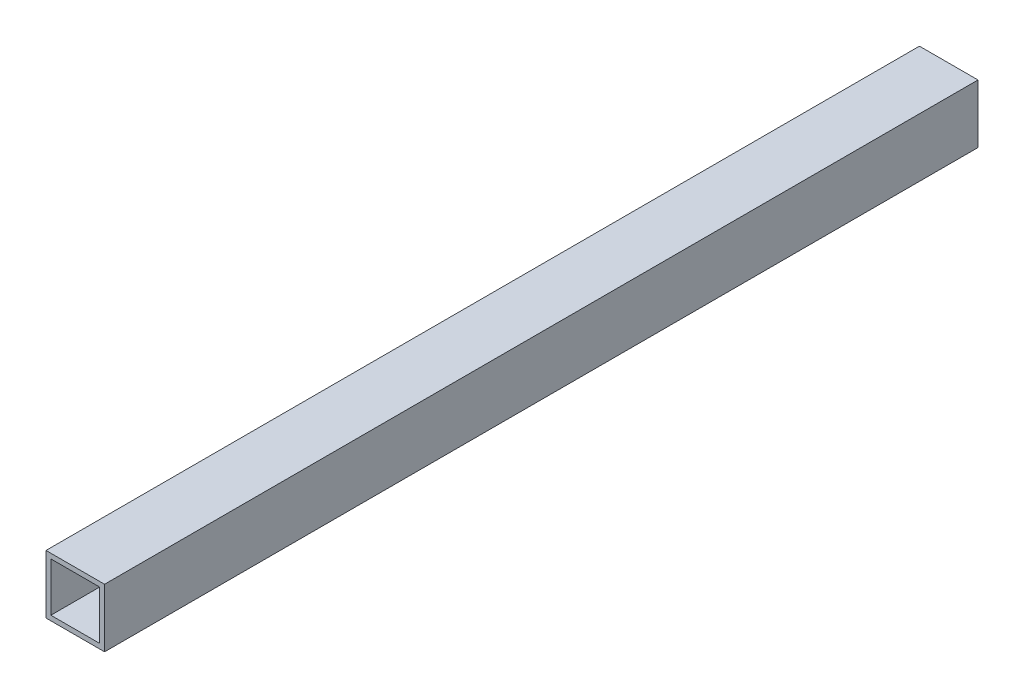
ISO-10303-21;
HEADER;
FILE_DESCRIPTION(('STEP AP214'),'2;1');
FILE_NAME('part.step','',(''),(''),'','','');
FILE_SCHEMA(('AUTOMOTIVE_DESIGN { 1 0 10303 214 1 1 1 1 }'));
ENDSEC;
DATA;
#1=APPLICATION_CONTEXT('core data for automotive mechanical design processes');
#2=APPLICATION_PROTOCOL_DEFINITION('international standard','automotive_design',2000,#1);
#3=PRODUCT_CONTEXT('',#1,'mechanical');
#4=PRODUCT('Part','Part','',(#3));
#5=PRODUCT_RELATED_PRODUCT_CATEGORY('part','',(#4));
#6=PRODUCT_DEFINITION_FORMATION('','',#4);
#7=PRODUCT_DEFINITION_CONTEXT('part definition',#1,'design');
#8=PRODUCT_DEFINITION('design','',#6,#7);
#9=PRODUCT_DEFINITION_SHAPE('','',#8);
#10=(LENGTH_UNIT() NAMED_UNIT(*) SI_UNIT(.MILLI.,.METRE.));
#11=(NAMED_UNIT(*) PLANE_ANGLE_UNIT() SI_UNIT($,.RADIAN.));
#12=(NAMED_UNIT(*) SI_UNIT($,.STERADIAN.) SOLID_ANGLE_UNIT());
#13=UNCERTAINTY_MEASURE_WITH_UNIT(LENGTH_MEASURE(1.E-05),#10,'distance_accuracy_value','');
#14=(GEOMETRIC_REPRESENTATION_CONTEXT(3) GLOBAL_UNCERTAINTY_ASSIGNED_CONTEXT((#13)) GLOBAL_UNIT_ASSIGNED_CONTEXT((#10,
#11,#12)) REPRESENTATION_CONTEXT('',''));
#15=CARTESIAN_POINT('',(0.,0.,0.));
#16=DIRECTION('',(0.,0.,1.));
#17=DIRECTION('',(1.,0.,0.));
#18=AXIS2_PLACEMENT_3D('',#15,#16,#17);
#19=CARTESIAN_POINT('',(0.,0.,358.));
#20=DIRECTION('',(0.,0.,1.));
#21=DIRECTION('',(1.,0.,0.));
#22=AXIS2_PLACEMENT_3D('',#19,#20,#21);
#23=PLANE('',#22);
#24=DIRECTION('',(0.,-1.,0.));
#25=VECTOR('',#24,1.);
#26=CARTESIAN_POINT('',(-12.,12.,358.));
#27=LINE('',#26,#25);
#28=CARTESIAN_POINT('',(-12.,12.,358.));
#29=VERTEX_POINT('',#28);
#30=CARTESIAN_POINT('',(-12.,-12.,358.));
#31=VERTEX_POINT('',#30);
#32=EDGE_CURVE('E136',#29,#31,#27,.T.);
#33=ORIENTED_EDGE('',*,*,#32,.T.);
#34=DIRECTION('',(1.,0.,0.));
#35=VECTOR('',#34,1.);
#36=CARTESIAN_POINT('',(-12.,-12.,358.));
#37=LINE('',#36,#35);
#38=CARTESIAN_POINT('',(12.,-12.,358.));
#39=VERTEX_POINT('',#38);
#40=EDGE_CURVE('E139',#31,#39,#37,.T.);
#41=ORIENTED_EDGE('',*,*,#40,.T.);
#42=DIRECTION('',(0.,1.,0.));
#43=VECTOR('',#42,1.);
#44=CARTESIAN_POINT('',(12.,12.,358.));
#45=LINE('',#44,#43);
#46=CARTESIAN_POINT('',(12.,12.,358.));
#47=VERTEX_POINT('',#46);
#48=EDGE_CURVE('E142',#39,#47,#45,.T.);
#49=ORIENTED_EDGE('',*,*,#48,.T.);
#50=DIRECTION('',(-1.,0.,0.));
#51=VECTOR('',#50,1.);
#52=CARTESIAN_POINT('',(-12.,12.,358.));
#53=LINE('',#52,#51);
#54=EDGE_CURVE('E144',#47,#29,#53,.T.);
#55=ORIENTED_EDGE('',*,*,#54,.T.);
#56=EDGE_LOOP('',(#33,#41,#49,#55));
#57=FACE_BOUND('',#56,.T.);
#58=DIRECTION('',(-1.,0.,0.));
#59=VECTOR('',#58,1.);
#60=CARTESIAN_POINT('',(-10.,10.,358.));
#61=LINE('',#60,#59);
#62=CARTESIAN_POINT('',(10.,10.,358.));
#63=VERTEX_POINT('',#62);
#64=CARTESIAN_POINT('',(-10.,10.,358.));
#65=VERTEX_POINT('',#64);
#66=EDGE_CURVE('E108',#63,#65,#61,.T.);
#67=ORIENTED_EDGE('',*,*,#66,.F.);
#68=DIRECTION('',(0.,1.,0.));
#69=VECTOR('',#68,1.);
#70=CARTESIAN_POINT('',(10.,10.,358.));
#71=LINE('',#70,#69);
#72=CARTESIAN_POINT('',(10.,-10.,358.));
#73=VERTEX_POINT('',#72);
#74=EDGE_CURVE('E100',#73,#63,#71,.T.);
#75=ORIENTED_EDGE('',*,*,#74,.F.);
#76=DIRECTION('',(1.,0.,0.));
#77=VECTOR('',#76,1.);
#78=CARTESIAN_POINT('',(-10.,-10.,358.));
#79=LINE('',#78,#77);
#80=CARTESIAN_POINT('',(-10.,-10.,358.));
#81=VERTEX_POINT('',#80);
#82=EDGE_CURVE('E122',#81,#73,#79,.T.);
#83=ORIENTED_EDGE('',*,*,#82,.F.);
#84=DIRECTION('',(0.,-1.,0.));
#85=VECTOR('',#84,1.);
#86=CARTESIAN_POINT('',(-10.,10.,358.));
#87=LINE('',#86,#85);
#88=EDGE_CURVE('E120',#65,#81,#87,.T.);
#89=ORIENTED_EDGE('',*,*,#88,.F.);
#90=EDGE_LOOP('',(#67,#75,#83,#89));
#91=FACE_BOUND('',#90,.T.);
#92=ADVANCED_FACE('F35',(#57,#91),#23,.T.);
#93=CARTESIAN_POINT('',(0.,0.,0.));
#94=DIRECTION('',(0.,0.,1.));
#95=DIRECTION('',(1.,0.,0.));
#96=AXIS2_PLACEMENT_3D('',#93,#94,#95);
#97=PLANE('',#96);
#98=DIRECTION('',(0.,-1.,0.));
#99=VECTOR('',#98,1.);
#100=CARTESIAN_POINT('',(-12.,12.,0.));
#101=LINE('',#100,#99);
#102=CARTESIAN_POINT('',(-12.,12.,0.));
#103=VERTEX_POINT('',#102);
#104=CARTESIAN_POINT('',(-12.,-12.,0.));
#105=VERTEX_POINT('',#104);
#106=EDGE_CURVE('E116',#103,#105,#101,.T.);
#107=ORIENTED_EDGE('',*,*,#106,.F.);
#108=DIRECTION('',(-1.,0.,0.));
#109=VECTOR('',#108,1.);
#110=CARTESIAN_POINT('',(-12.,12.,0.));
#111=LINE('',#110,#109);
#112=CARTESIAN_POINT('',(12.,12.,0.));
#113=VERTEX_POINT('',#112);
#114=EDGE_CURVE('E140',#113,#103,#111,.T.);
#115=ORIENTED_EDGE('',*,*,#114,.F.);
#116=DIRECTION('',(0.,1.,0.));
#117=VECTOR('',#116,1.);
#118=CARTESIAN_POINT('',(12.,12.,0.));
#119=LINE('',#118,#117);
#120=CARTESIAN_POINT('',(12.,-12.,0.));
#121=VERTEX_POINT('',#120);
#122=EDGE_CURVE('E151',#121,#113,#119,.T.);
#123=ORIENTED_EDGE('',*,*,#122,.F.);
#124=DIRECTION('',(1.,0.,0.));
#125=VECTOR('',#124,1.);
#126=CARTESIAN_POINT('',(-12.,-12.,0.));
#127=LINE('',#126,#125);
#128=EDGE_CURVE('E149',#105,#121,#127,.T.);
#129=ORIENTED_EDGE('',*,*,#128,.F.);
#130=EDGE_LOOP('',(#107,#115,#123,#129));
#131=FACE_BOUND('',#130,.T.);
#132=DIRECTION('',(0.,1.,0.));
#133=VECTOR('',#132,1.);
#134=CARTESIAN_POINT('',(10.,10.,0.));
#135=LINE('',#134,#133);
#136=CARTESIAN_POINT('',(10.,-10.,0.));
#137=VERTEX_POINT('',#136);
#138=CARTESIAN_POINT('',(10.,10.,0.));
#139=VERTEX_POINT('',#138);
#140=EDGE_CURVE('E58',#137,#139,#135,.T.);
#141=ORIENTED_EDGE('',*,*,#140,.T.);
#142=DIRECTION('',(-1.,0.,0.));
#143=VECTOR('',#142,1.);
#144=CARTESIAN_POINT('',(-10.,10.,0.));
#145=LINE('',#144,#143);
#146=CARTESIAN_POINT('',(-10.,10.,0.));
#147=VERTEX_POINT('',#146);
#148=EDGE_CURVE('E115',#139,#147,#145,.T.);
#149=ORIENTED_EDGE('',*,*,#148,.T.);
#150=DIRECTION('',(0.,-1.,0.));
#151=VECTOR('',#150,1.);
#152=CARTESIAN_POINT('',(-10.,10.,0.));
#153=LINE('',#152,#151);
#154=CARTESIAN_POINT('',(-10.,-10.,0.));
#155=VERTEX_POINT('',#154);
#156=EDGE_CURVE('E128',#147,#155,#153,.T.);
#157=ORIENTED_EDGE('',*,*,#156,.T.);
#158=DIRECTION('',(1.,0.,0.));
#159=VECTOR('',#158,1.);
#160=CARTESIAN_POINT('',(-10.,-10.,0.));
#161=LINE('',#160,#159);
#162=EDGE_CURVE('E109',#155,#137,#161,.T.);
#163=ORIENTED_EDGE('',*,*,#162,.T.);
#164=EDGE_LOOP('',(#141,#149,#157,#163));
#165=FACE_BOUND('',#164,.T.);
#166=ADVANCED_FACE('F169',(#131,#165),#97,.F.);
#167=CARTESIAN_POINT('',(-12.,12.,358.));
#168=DIRECTION('',(1.,0.,0.));
#169=DIRECTION('',(0.,1.,0.));
#170=AXIS2_PLACEMENT_3D('',#167,#168,#169);
#171=PLANE('',#170);
#172=ORIENTED_EDGE('',*,*,#106,.T.);
#173=DIRECTION('',(0.,0.,-1.));
#174=VECTOR('',#173,1.);
#175=CARTESIAN_POINT('',(-12.,-12.,358.));
#176=LINE('',#175,#174);
#177=EDGE_CURVE('E11',#31,#105,#176,.T.);
#178=ORIENTED_EDGE('',*,*,#177,.F.);
#179=ORIENTED_EDGE('',*,*,#32,.F.);
#180=DIRECTION('',(0.,0.,-1.));
#181=VECTOR('',#180,1.);
#182=CARTESIAN_POINT('',(-12.,12.,358.));
#183=LINE('',#182,#181);
#184=EDGE_CURVE('E146',#29,#103,#183,.T.);
#185=ORIENTED_EDGE('',*,*,#184,.T.);
#186=EDGE_LOOP('',(#172,#178,#179,#185));
#187=FACE_BOUND('',#186,.T.);
#188=ADVANCED_FACE('F37',(#187),#171,.F.);
#189=CARTESIAN_POINT('',(-12.,-12.,358.));
#190=DIRECTION('',(0.,1.,0.));
#191=DIRECTION('',(-1.,0.,0.));
#192=AXIS2_PLACEMENT_3D('',#189,#190,#191);
#193=PLANE('',#192);
#194=ORIENTED_EDGE('',*,*,#128,.T.);
#195=DIRECTION('',(0.,0.,-1.));
#196=VECTOR('',#195,1.);
#197=CARTESIAN_POINT('',(12.,-12.,358.));
#198=LINE('',#197,#196);
#199=EDGE_CURVE('E43',#39,#121,#198,.T.);
#200=ORIENTED_EDGE('',*,*,#199,.F.);
#201=ORIENTED_EDGE('',*,*,#40,.F.);
#202=ORIENTED_EDGE('',*,*,#177,.T.);
#203=EDGE_LOOP('',(#194,#200,#201,#202));
#204=FACE_BOUND('',#203,.T.);
#205=ADVANCED_FACE('F179',(#204),#193,.F.);
#206=CARTESIAN_POINT('',(12.,12.,358.));
#207=DIRECTION('',(-1.,0.,0.));
#208=DIRECTION('',(0.,-1.,0.));
#209=AXIS2_PLACEMENT_3D('',#206,#207,#208);
#210=PLANE('',#209);
#211=ORIENTED_EDGE('',*,*,#122,.T.);
#212=DIRECTION('',(0.,0.,-1.));
#213=VECTOR('',#212,1.);
#214=CARTESIAN_POINT('',(12.,12.,358.));
#215=LINE('',#214,#213);
#216=EDGE_CURVE('E156',#47,#113,#215,.T.);
#217=ORIENTED_EDGE('',*,*,#216,.F.);
#218=ORIENTED_EDGE('',*,*,#48,.F.);
#219=ORIENTED_EDGE('',*,*,#199,.T.);
#220=EDGE_LOOP('',(#211,#217,#218,#219));
#221=FACE_BOUND('',#220,.T.);
#222=ADVANCED_FACE('F163',(#221),#210,.F.);
#223=CARTESIAN_POINT('',(-12.,12.,358.));
#224=DIRECTION('',(0.,-1.,0.));
#225=DIRECTION('',(0.,0.,-1.));
#226=AXIS2_PLACEMENT_3D('',#223,#224,#225);
#227=PLANE('',#226);
#228=ORIENTED_EDGE('',*,*,#114,.T.);
#229=ORIENTED_EDGE('',*,*,#184,.F.);
#230=ORIENTED_EDGE('',*,*,#54,.F.);
#231=ORIENTED_EDGE('',*,*,#216,.T.);
#232=EDGE_LOOP('',(#228,#229,#230,#231));
#233=FACE_BOUND('',#232,.T.);
#234=ADVANCED_FACE('F173',(#233),#227,.F.);
#235=CARTESIAN_POINT('',(10.,10.,358.));
#236=DIRECTION('',(-1.,0.,0.));
#237=DIRECTION('',(0.,0.,1.));
#238=AXIS2_PLACEMENT_3D('',#235,#236,#237);
#239=PLANE('',#238);
#240=ORIENTED_EDGE('',*,*,#140,.F.);
#241=DIRECTION('',(0.,0.,-1.));
#242=VECTOR('',#241,1.);
#243=CARTESIAN_POINT('',(10.,-10.,358.));
#244=LINE('',#243,#242);
#245=EDGE_CURVE('E104',#73,#137,#244,.T.);
#246=ORIENTED_EDGE('',*,*,#245,.F.);
#247=ORIENTED_EDGE('',*,*,#74,.T.);
#248=DIRECTION('',(0.,0.,-1.));
#249=VECTOR('',#248,1.);
#250=CARTESIAN_POINT('',(10.,10.,358.));
#251=LINE('',#250,#249);
#252=EDGE_CURVE('E103',#63,#139,#251,.T.);
#253=ORIENTED_EDGE('',*,*,#252,.T.);
#254=EDGE_LOOP('',(#240,#246,#247,#253));
#255=FACE_BOUND('',#254,.T.);
#256=ADVANCED_FACE('F102',(#255),#239,.T.);
#257=CARTESIAN_POINT('',(-10.,10.,358.));
#258=DIRECTION('',(0.,-1.,0.));
#259=DIRECTION('',(0.,0.,-1.));
#260=AXIS2_PLACEMENT_3D('',#257,#258,#259);
#261=PLANE('',#260);
#262=ORIENTED_EDGE('',*,*,#148,.F.);
#263=ORIENTED_EDGE('',*,*,#252,.F.);
#264=ORIENTED_EDGE('',*,*,#66,.T.);
#265=DIRECTION('',(0.,0.,-1.));
#266=VECTOR('',#265,1.);
#267=CARTESIAN_POINT('',(-10.,10.,358.));
#268=LINE('',#267,#266);
#269=EDGE_CURVE('E117',#65,#147,#268,.T.);
#270=ORIENTED_EDGE('',*,*,#269,.T.);
#271=EDGE_LOOP('',(#262,#263,#264,#270));
#272=FACE_BOUND('',#271,.T.);
#273=ADVANCED_FACE('F112',(#272),#261,.T.);
#274=CARTESIAN_POINT('',(-10.,10.,358.));
#275=DIRECTION('',(1.,0.,0.));
#276=DIRECTION('',(0.,1.,0.));
#277=AXIS2_PLACEMENT_3D('',#274,#275,#276);
#278=PLANE('',#277);
#279=ORIENTED_EDGE('',*,*,#156,.F.);
#280=ORIENTED_EDGE('',*,*,#269,.F.);
#281=ORIENTED_EDGE('',*,*,#88,.T.);
#282=DIRECTION('',(0.,0.,-1.));
#283=VECTOR('',#282,1.);
#284=CARTESIAN_POINT('',(-10.,-10.,358.));
#285=LINE('',#284,#283);
#286=EDGE_CURVE('E50',#81,#155,#285,.T.);
#287=ORIENTED_EDGE('',*,*,#286,.T.);
#288=EDGE_LOOP('',(#279,#280,#281,#287));
#289=FACE_BOUND('',#288,.T.);
#290=ADVANCED_FACE('F202',(#289),#278,.T.);
#291=CARTESIAN_POINT('',(-10.,-10.,358.));
#292=DIRECTION('',(0.,1.,0.));
#293=DIRECTION('',(0.,0.,1.));
#294=AXIS2_PLACEMENT_3D('',#291,#292,#293);
#295=PLANE('',#294);
#296=ORIENTED_EDGE('',*,*,#162,.F.);
#297=ORIENTED_EDGE('',*,*,#286,.F.);
#298=ORIENTED_EDGE('',*,*,#82,.T.);
#299=ORIENTED_EDGE('',*,*,#245,.T.);
#300=EDGE_LOOP('',(#296,#297,#298,#299));
#301=FACE_BOUND('',#300,.T.);
#302=ADVANCED_FACE('F206',(#301),#295,.T.);
#303=CLOSED_SHELL('',(#92,#166,#188,#205,#222,#234,#256,#273,#290,#302));
#304=MANIFOLD_SOLID_BREP('B2',#303);
#305=ADVANCED_BREP_SHAPE_REPRESENTATION('',(#18,#304),#14);
#306=SHAPE_DEFINITION_REPRESENTATION(#9,#305);
ENDSEC;
END-ISO-10303-21;
